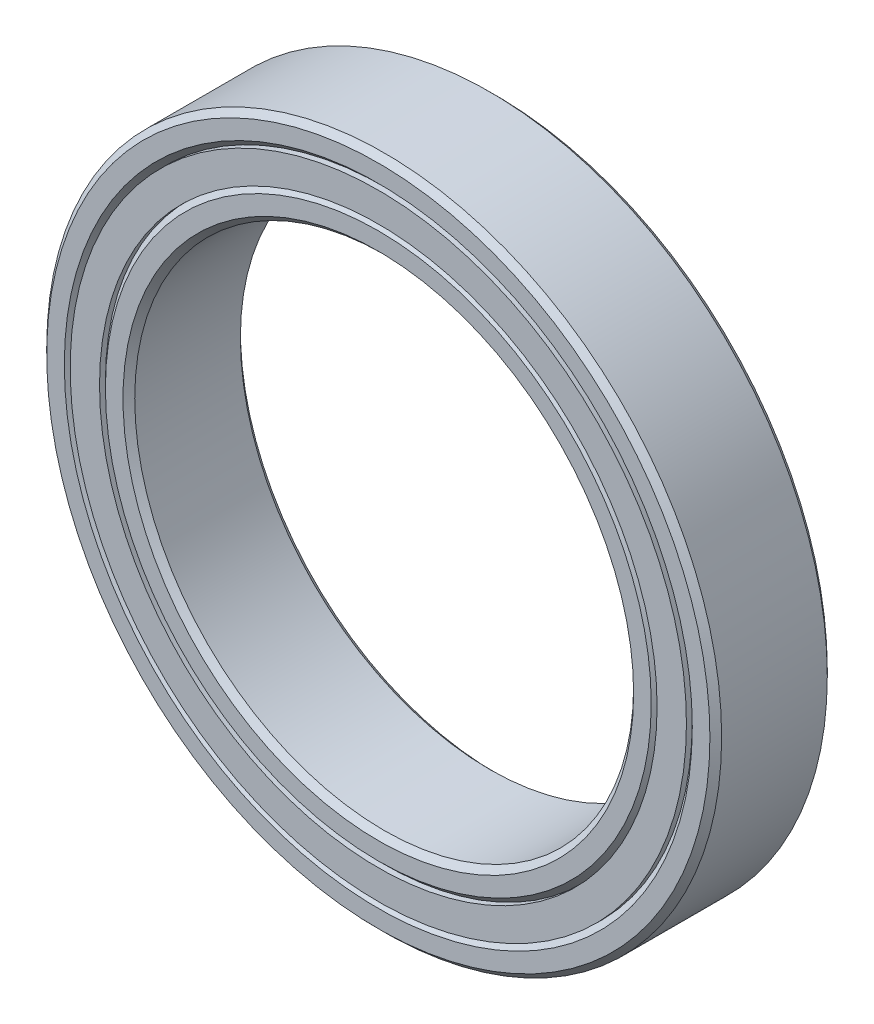
ISO-10303-21;
HEADER;
FILE_DESCRIPTION(('STEP AP214'),'2;1');
FILE_NAME('part.step','',(''),(''),'','','');
FILE_SCHEMA(('AUTOMOTIVE_DESIGN { 1 0 10303 214 1 1 1 1 }'));
ENDSEC;
DATA;
#1=APPLICATION_CONTEXT('core data for automotive mechanical design processes');
#2=APPLICATION_PROTOCOL_DEFINITION('international standard','automotive_design',2000,#1);
#3=PRODUCT_CONTEXT('',#1,'mechanical');
#4=PRODUCT('Part','Part','',(#3));
#5=PRODUCT_RELATED_PRODUCT_CATEGORY('part','',(#4));
#6=PRODUCT_DEFINITION_FORMATION('','',#4);
#7=PRODUCT_DEFINITION_CONTEXT('part definition',#1,'design');
#8=PRODUCT_DEFINITION('design','',#6,#7);
#9=PRODUCT_DEFINITION_SHAPE('','',#8);
#10=(LENGTH_UNIT() NAMED_UNIT(*) SI_UNIT(.MILLI.,.METRE.));
#11=(NAMED_UNIT(*) PLANE_ANGLE_UNIT() SI_UNIT($,.RADIAN.));
#12=(NAMED_UNIT(*) SI_UNIT($,.STERADIAN.) SOLID_ANGLE_UNIT());
#13=UNCERTAINTY_MEASURE_WITH_UNIT(LENGTH_MEASURE(1.E-05),#10,'distance_accuracy_value','');
#14=(GEOMETRIC_REPRESENTATION_CONTEXT(3) GLOBAL_UNCERTAINTY_ASSIGNED_CONTEXT((#13)) GLOBAL_UNIT_ASSIGNED_CONTEXT((#10,
#11,#12)) REPRESENTATION_CONTEXT('',''));
#15=CARTESIAN_POINT('',(0.,0.,0.));
#16=DIRECTION('',(0.,0.,1.));
#17=DIRECTION('',(1.,0.,0.));
#18=AXIS2_PLACEMENT_3D('',#15,#16,#17);
#19=CARTESIAN_POINT('',(0.,0.,4.));
#20=DIRECTION('',(0.,0.,-1.));
#21=DIRECTION('',(-1.,0.,0.));
#22=AXIS2_PLACEMENT_3D('',#19,#20,#21);
#23=CYLINDRICAL_SURFACE('',#22,9.5);
#24=CARTESIAN_POINT('',(0.,0.,0.199999999999997));
#25=DIRECTION('',(0.,0.,1.));
#26=DIRECTION('',(1.,0.,0.));
#27=AXIS2_PLACEMENT_3D('',#24,#25,#26);
#28=CIRCLE('',#27,9.5);
#29=CARTESIAN_POINT('',(9.5,0.,0.199999999999997));
#30=VERTEX_POINT('',#29);
#31=EDGE_CURVE('E11',#30,#30,#28,.F.);
#32=ORIENTED_EDGE('',*,*,#31,.F.);
#33=EDGE_LOOP('',(#32));
#34=FACE_BOUND('',#33,.T.);
#35=CARTESIAN_POINT('',(0.,0.,0.));
#36=DIRECTION('',(0.,0.,1.));
#37=DIRECTION('',(1.,0.,0.));
#38=AXIS2_PLACEMENT_3D('',#35,#36,#37);
#39=CIRCLE('',#38,9.5);
#40=CARTESIAN_POINT('',(9.5,0.,0.));
#41=VERTEX_POINT('',#40);
#42=EDGE_CURVE('E81',#41,#41,#39,.T.);
#43=ORIENTED_EDGE('',*,*,#42,.F.);
#44=EDGE_LOOP('',(#43));
#45=FACE_BOUND('',#44,.T.);
#46=ADVANCED_FACE('F38',(#34,#45),#23,.F.);
#47=CARTESIAN_POINT('',(0.,0.,4.));
#48=DIRECTION('',(0.,0.,-1.));
#49=DIRECTION('',(-1.,0.,0.));
#50=AXIS2_PLACEMENT_3D('',#47,#48,#49);
#51=CYLINDRICAL_SURFACE('',#50,11.5);
#52=CARTESIAN_POINT('',(0.,0.,3.8));
#53=DIRECTION('',(0.,0.,1.));
#54=DIRECTION('',(1.,0.,0.));
#55=AXIS2_PLACEMENT_3D('',#52,#53,#54);
#56=CIRCLE('',#55,11.5);
#57=CARTESIAN_POINT('',(11.5,0.,3.8));
#58=VERTEX_POINT('',#57);
#59=EDGE_CURVE('E58',#58,#58,#56,.F.);
#60=ORIENTED_EDGE('',*,*,#59,.T.);
#61=EDGE_LOOP('',(#60));
#62=FACE_BOUND('',#61,.T.);
#63=CARTESIAN_POINT('',(0.,0.,0.200000000000002));
#64=DIRECTION('',(0.,0.,1.));
#65=DIRECTION('',(1.,0.,0.));
#66=AXIS2_PLACEMENT_3D('',#63,#64,#65);
#67=CIRCLE('',#66,11.5);
#68=CARTESIAN_POINT('',(11.5,0.,0.200000000000002));
#69=VERTEX_POINT('',#68);
#70=EDGE_CURVE('E61',#69,#69,#67,.T.);
#71=ORIENTED_EDGE('',*,*,#70,.T.);
#72=EDGE_LOOP('',(#71));
#73=FACE_BOUND('',#72,.T.);
#74=ADVANCED_FACE('F124',(#62,#73),#51,.T.);
#75=CARTESIAN_POINT('',(0.,0.,4.));
#76=DIRECTION('',(0.,0.,1.));
#77=DIRECTION('',(1.,0.,0.));
#78=AXIS2_PLACEMENT_3D('',#75,#76,#77);
#79=PLANE('',#78);
#80=CARTESIAN_POINT('',(0.,0.,4.));
#81=DIRECTION('',(0.,0.,1.));
#82=DIRECTION('',(1.,0.,0.));
#83=AXIS2_PLACEMENT_3D('',#80,#81,#82);
#84=CIRCLE('',#83,10.7);
#85=CARTESIAN_POINT('',(10.7,0.,4.));
#86=VERTEX_POINT('',#85);
#87=EDGE_CURVE('E64',#86,#86,#84,.F.);
#88=ORIENTED_EDGE('',*,*,#87,.T.);
#89=EDGE_LOOP('',(#88));
#90=FACE_BOUND('',#89,.T.);
#91=CARTESIAN_POINT('',(0.,0.,4.));
#92=DIRECTION('',(0.,0.,1.));
#93=DIRECTION('',(1.,0.,0.));
#94=AXIS2_PLACEMENT_3D('',#91,#92,#93);
#95=CIRCLE('',#94,11.3);
#96=CARTESIAN_POINT('',(11.3,0.,4.));
#97=VERTEX_POINT('',#96);
#98=EDGE_CURVE('E67',#97,#97,#95,.T.);
#99=ORIENTED_EDGE('',*,*,#98,.T.);
#100=EDGE_LOOP('',(#99));
#101=FACE_BOUND('',#100,.T.);
#102=ADVANCED_FACE('F131',(#90,#101),#79,.T.);
#103=CARTESIAN_POINT('',(0.,0.,0.));
#104=DIRECTION('',(0.,0.,1.));
#105=DIRECTION('',(1.,0.,0.));
#106=AXIS2_PLACEMENT_3D('',#103,#104,#105);
#107=PLANE('',#106);
#108=CARTESIAN_POINT('',(0.,0.,0.));
#109=DIRECTION('',(0.,0.,1.));
#110=DIRECTION('',(1.,0.,0.));
#111=AXIS2_PLACEMENT_3D('',#108,#109,#110);
#112=CIRCLE('',#111,11.3);
#113=CARTESIAN_POINT('',(11.3,0.,0.));
#114=VERTEX_POINT('',#113);
#115=EDGE_CURVE('E49',#114,#114,#112,.F.);
#116=ORIENTED_EDGE('',*,*,#115,.T.);
#117=EDGE_LOOP('',(#116));
#118=FACE_BOUND('',#117,.T.);
#119=CARTESIAN_POINT('',(0.,0.,0.));
#120=DIRECTION('',(0.,0.,1.));
#121=DIRECTION('',(1.,0.,0.));
#122=AXIS2_PLACEMENT_3D('',#119,#120,#121);
#123=CIRCLE('',#122,10.7);
#124=CARTESIAN_POINT('',(10.7,0.,0.));
#125=VERTEX_POINT('',#124);
#126=EDGE_CURVE('E53',#125,#125,#123,.T.);
#127=ORIENTED_EDGE('',*,*,#126,.T.);
#128=EDGE_LOOP('',(#127));
#129=FACE_BOUND('',#128,.T.);
#130=ADVANCED_FACE('F257',(#118,#129),#107,.F.);
#131=CARTESIAN_POINT('',(0.,0.,3.8));
#132=DIRECTION('',(0.,0.,1.));
#133=DIRECTION('',(1.,0.,0.));
#134=AXIS2_PLACEMENT_3D('',#131,#132,#133);
#135=CONICAL_SURFACE('',#134,10.5,0.785398163397448);
#136=ORIENTED_EDGE('',*,*,#87,.F.);
#137=EDGE_LOOP('',(#136));
#138=FACE_BOUND('',#137,.T.);
#139=CARTESIAN_POINT('',(0.,0.,3.8));
#140=DIRECTION('',(0.,0.,1.));
#141=DIRECTION('',(1.,0.,0.));
#142=AXIS2_PLACEMENT_3D('',#139,#140,#141);
#143=CIRCLE('',#142,10.5);
#144=CARTESIAN_POINT('',(10.5,0.,3.8));
#145=VERTEX_POINT('',#144);
#146=EDGE_CURVE('E70',#145,#145,#143,.T.);
#147=ORIENTED_EDGE('',*,*,#146,.F.);
#148=EDGE_LOOP('',(#147));
#149=FACE_BOUND('',#148,.T.);
#150=ADVANCED_FACE('F247',(#138,#149),#135,.F.);
#151=CARTESIAN_POINT('',(0.,0.,4.));
#152=DIRECTION('',(0.,0.,-1.));
#153=DIRECTION('',(-1.,0.,0.));
#154=AXIS2_PLACEMENT_3D('',#151,#152,#153);
#155=CONICAL_SURFACE('',#154,11.3,0.785398163397453);
#156=ORIENTED_EDGE('',*,*,#59,.F.);
#157=EDGE_LOOP('',(#156));
#158=FACE_BOUND('',#157,.T.);
#159=ORIENTED_EDGE('',*,*,#98,.F.);
#160=EDGE_LOOP('',(#159));
#161=FACE_BOUND('',#160,.T.);
#162=ADVANCED_FACE('F238',(#158,#161),#155,.T.);
#163=CARTESIAN_POINT('',(0.,0.,0.200000000000002));
#164=DIRECTION('',(0.,0.,1.));
#165=DIRECTION('',(1.,0.,0.));
#166=AXIS2_PLACEMENT_3D('',#163,#164,#165);
#167=CONICAL_SURFACE('',#166,11.5,0.785398163397448);
#168=ORIENTED_EDGE('',*,*,#115,.F.);
#169=EDGE_LOOP('',(#168));
#170=FACE_BOUND('',#169,.T.);
#171=ORIENTED_EDGE('',*,*,#70,.F.);
#172=EDGE_LOOP('',(#171));
#173=FACE_BOUND('',#172,.T.);
#174=ADVANCED_FACE('F229',(#170,#173),#167,.T.);
#175=CARTESIAN_POINT('',(0.,0.,0.));
#176=DIRECTION('',(0.,0.,-1.));
#177=DIRECTION('',(-1.,0.,0.));
#178=AXIS2_PLACEMENT_3D('',#175,#176,#177);
#179=CONICAL_SURFACE('',#178,10.7,0.785398163397448);
#180=CARTESIAN_POINT('',(0.,0.,0.199999999999999));
#181=DIRECTION('',(0.,0.,1.));
#182=DIRECTION('',(1.,0.,0.));
#183=AXIS2_PLACEMENT_3D('',#180,#181,#182);
#184=CIRCLE('',#183,10.5);
#185=CARTESIAN_POINT('',(10.5,0.,0.199999999999999));
#186=VERTEX_POINT('',#185);
#187=EDGE_CURVE('E73',#186,#186,#184,.F.);
#188=ORIENTED_EDGE('',*,*,#187,.F.);
#189=EDGE_LOOP('',(#188));
#190=FACE_BOUND('',#189,.T.);
#191=ORIENTED_EDGE('',*,*,#126,.F.);
#192=EDGE_LOOP('',(#191));
#193=FACE_BOUND('',#192,.T.);
#194=ADVANCED_FACE('F40',(#190,#193),#179,.F.);
#195=CARTESIAN_POINT('',(0.,0.,4.));
#196=DIRECTION('',(0.,0.,-1.));
#197=DIRECTION('',(-1.,0.,0.));
#198=AXIS2_PLACEMENT_3D('',#195,#196,#197);
#199=CYLINDRICAL_SURFACE('',#198,10.5);
#200=ORIENTED_EDGE('',*,*,#146,.T.);
#201=EDGE_LOOP('',(#200));
#202=FACE_BOUND('',#201,.T.);
#203=CARTESIAN_POINT('',(0.,0.,4.));
#204=DIRECTION('',(0.,0.,1.));
#205=DIRECTION('',(1.,0.,0.));
#206=AXIS2_PLACEMENT_3D('',#203,#204,#205);
#207=CIRCLE('',#206,10.5);
#208=CARTESIAN_POINT('',(10.5,0.,4.));
#209=VERTEX_POINT('',#208);
#210=EDGE_CURVE('E76',#209,#209,#207,.T.);
#211=ORIENTED_EDGE('',*,*,#210,.F.);
#212=EDGE_LOOP('',(#211));
#213=FACE_BOUND('',#212,.T.);
#214=ADVANCED_FACE('F139',(#202,#213),#199,.T.);
#215=CARTESIAN_POINT('',(0.,0.,3.8));
#216=DIRECTION('',(0.,0.,-1.));
#217=DIRECTION('',(-1.,0.,0.));
#218=AXIS2_PLACEMENT_3D('',#215,#216,#217);
#219=CIRCLE('',#218,9.5);
#220=CARTESIAN_POINT('',(-9.5,0.,3.8));
#221=VERTEX_POINT('',#220);
#222=EDGE_CURVE('E45',#221,#221,#219,.F.);
#223=ORIENTED_EDGE('',*,*,#222,.F.);
#224=EDGE_LOOP('',(#223));
#225=FACE_BOUND('',#224,.T.);
#226=CARTESIAN_POINT('',(0.,0.,4.));
#227=DIRECTION('',(0.,0.,1.));
#228=DIRECTION('',(1.,0.,0.));
#229=AXIS2_PLACEMENT_3D('',#226,#227,#228);
#230=CIRCLE('',#229,9.5);
#231=CARTESIAN_POINT('',(9.5,0.,4.));
#232=VERTEX_POINT('',#231);
#233=EDGE_CURVE('E80',#232,#232,#230,.T.);
#234=ORIENTED_EDGE('',*,*,#233,.T.);
#235=EDGE_LOOP('',(#234));
#236=FACE_BOUND('',#235,.T.);
#237=ADVANCED_FACE('F127',(#225,#236),#23,.F.);
#238=ORIENTED_EDGE('',*,*,#187,.T.);
#239=EDGE_LOOP('',(#238));
#240=FACE_BOUND('',#239,.T.);
#241=CARTESIAN_POINT('',(0.,0.,0.));
#242=DIRECTION('',(0.,0.,1.));
#243=DIRECTION('',(1.,0.,0.));
#244=AXIS2_PLACEMENT_3D('',#241,#242,#243);
#245=CIRCLE('',#244,10.5);
#246=CARTESIAN_POINT('',(10.5,0.,0.));
#247=VERTEX_POINT('',#246);
#248=EDGE_CURVE('E77',#247,#247,#245,.T.);
#249=ORIENTED_EDGE('',*,*,#248,.T.);
#250=EDGE_LOOP('',(#249));
#251=FACE_BOUND('',#250,.T.);
#252=ADVANCED_FACE('F138',(#240,#251),#199,.T.);
#253=CARTESIAN_POINT('',(0.,0.,4.));
#254=DIRECTION('',(0.,0.,1.));
#255=DIRECTION('',(1.,0.,0.));
#256=AXIS2_PLACEMENT_3D('',#253,#254,#255);
#257=PLANE('',#256);
#258=ORIENTED_EDGE('',*,*,#233,.F.);
#259=EDGE_LOOP('',(#258));
#260=FACE_BOUND('',#259,.T.);
#261=ORIENTED_EDGE('',*,*,#210,.T.);
#262=EDGE_LOOP('',(#261));
#263=FACE_BOUND('',#262,.T.);
#264=ADVANCED_FACE('F145',(#260,#263),#257,.T.);
#265=CARTESIAN_POINT('',(0.,0.,0.));
#266=DIRECTION('',(0.,0.,1.));
#267=DIRECTION('',(1.,0.,0.));
#268=AXIS2_PLACEMENT_3D('',#265,#266,#267);
#269=PLANE('',#268);
#270=ORIENTED_EDGE('',*,*,#42,.T.);
#271=EDGE_LOOP('',(#270));
#272=FACE_BOUND('',#271,.T.);
#273=ORIENTED_EDGE('',*,*,#248,.F.);
#274=EDGE_LOOP('',(#273));
#275=FACE_BOUND('',#274,.T.);
#276=ADVANCED_FACE('F153',(#272,#275),#269,.F.);
#277=CARTESIAN_POINT('',(0.,0.,4.));
#278=DIRECTION('',(0.,0.,-1.));
#279=DIRECTION('',(-1.,0.,0.));
#280=AXIS2_PLACEMENT_3D('',#277,#278,#279);
#281=CYLINDRICAL_SURFACE('',#280,8.5);
#282=CARTESIAN_POINT('',(0.,0.,0.200000000000001));
#283=DIRECTION('',(0.,0.,1.));
#284=DIRECTION('',(1.,0.,0.));
#285=AXIS2_PLACEMENT_3D('',#282,#283,#284);
#286=CIRCLE('',#285,8.5);
#287=CARTESIAN_POINT('',(8.5,0.,0.200000000000001));
#288=VERTEX_POINT('',#287);
#289=EDGE_CURVE('E94',#288,#288,#286,.F.);
#290=ORIENTED_EDGE('',*,*,#289,.T.);
#291=EDGE_LOOP('',(#290));
#292=FACE_BOUND('',#291,.T.);
#293=CARTESIAN_POINT('',(0.,0.,3.8));
#294=DIRECTION('',(0.,0.,1.));
#295=DIRECTION('',(1.,0.,0.));
#296=AXIS2_PLACEMENT_3D('',#293,#294,#295);
#297=CIRCLE('',#296,8.5);
#298=CARTESIAN_POINT('',(8.5,0.,3.8));
#299=VERTEX_POINT('',#298);
#300=EDGE_CURVE('E97',#299,#299,#297,.T.);
#301=ORIENTED_EDGE('',*,*,#300,.T.);
#302=EDGE_LOOP('',(#301));
#303=FACE_BOUND('',#302,.T.);
#304=ADVANCED_FACE('F160',(#292,#303),#281,.F.);
#305=CARTESIAN_POINT('',(0.,0.,4.));
#306=DIRECTION('',(0.,0.,1.));
#307=DIRECTION('',(1.,0.,0.));
#308=AXIS2_PLACEMENT_3D('',#305,#306,#307);
#309=PLANE('',#308);
#310=CARTESIAN_POINT('',(0.,0.,4.));
#311=DIRECTION('',(0.,0.,1.));
#312=DIRECTION('',(1.,0.,0.));
#313=AXIS2_PLACEMENT_3D('',#310,#311,#312);
#314=CIRCLE('',#313,8.7);
#315=CARTESIAN_POINT('',(8.7,0.,4.));
#316=VERTEX_POINT('',#315);
#317=EDGE_CURVE('E84',#316,#316,#314,.F.);
#318=ORIENTED_EDGE('',*,*,#317,.T.);
#319=EDGE_LOOP('',(#318));
#320=FACE_BOUND('',#319,.T.);
#321=CARTESIAN_POINT('',(0.,0.,4.));
#322=DIRECTION('',(0.,0.,1.));
#323=DIRECTION('',(1.,0.,0.));
#324=AXIS2_PLACEMENT_3D('',#321,#322,#323);
#325=CIRCLE('',#324,9.3);
#326=CARTESIAN_POINT('',(9.3,0.,4.));
#327=VERTEX_POINT('',#326);
#328=EDGE_CURVE('E91',#327,#327,#325,.T.);
#329=ORIENTED_EDGE('',*,*,#328,.T.);
#330=EDGE_LOOP('',(#329));
#331=FACE_BOUND('',#330,.T.);
#332=ADVANCED_FACE('F170',(#320,#331),#309,.T.);
#333=CARTESIAN_POINT('',(0.,0.,0.));
#334=DIRECTION('',(0.,0.,1.));
#335=DIRECTION('',(1.,0.,0.));
#336=AXIS2_PLACEMENT_3D('',#333,#334,#335);
#337=PLANE('',#336);
#338=CARTESIAN_POINT('',(0.,0.,0.));
#339=DIRECTION('',(0.,0.,1.));
#340=DIRECTION('',(1.,0.,0.));
#341=AXIS2_PLACEMENT_3D('',#338,#339,#340);
#342=CIRCLE('',#341,8.7);
#343=CARTESIAN_POINT('',(8.7,0.,0.));
#344=VERTEX_POINT('',#343);
#345=EDGE_CURVE('E100',#344,#344,#342,.T.);
#346=ORIENTED_EDGE('',*,*,#345,.T.);
#347=EDGE_LOOP('',(#346));
#348=FACE_BOUND('',#347,.T.);
#349=CARTESIAN_POINT('',(0.,0.,0.));
#350=DIRECTION('',(0.,0.,1.));
#351=DIRECTION('',(1.,0.,0.));
#352=AXIS2_PLACEMENT_3D('',#349,#350,#351);
#353=CIRCLE('',#352,9.3);
#354=CARTESIAN_POINT('',(9.3,0.,0.));
#355=VERTEX_POINT('',#354);
#356=EDGE_CURVE('E103',#355,#355,#353,.F.);
#357=ORIENTED_EDGE('',*,*,#356,.T.);
#358=EDGE_LOOP('',(#357));
#359=FACE_BOUND('',#358,.T.);
#360=ADVANCED_FACE('F107',(#348,#359),#337,.F.);
#361=CARTESIAN_POINT('',(0.,0.,0.));
#362=DIRECTION('',(0.,0.,-1.));
#363=DIRECTION('',(-1.,0.,0.));
#364=AXIS2_PLACEMENT_3D('',#361,#362,#363);
#365=CONICAL_SURFACE('',#364,8.7,0.785398163397448);
#366=ORIENTED_EDGE('',*,*,#289,.F.);
#367=EDGE_LOOP('',(#366));
#368=FACE_BOUND('',#367,.T.);
#369=ORIENTED_EDGE('',*,*,#345,.F.);
#370=EDGE_LOOP('',(#369));
#371=FACE_BOUND('',#370,.T.);
#372=ADVANCED_FACE('F112',(#368,#371),#365,.F.);
#373=CARTESIAN_POINT('',(0.,0.,0.199999999999997));
#374=DIRECTION('',(0.,0.,1.));
#375=DIRECTION('',(1.,0.,0.));
#376=AXIS2_PLACEMENT_3D('',#373,#374,#375);
#377=CONICAL_SURFACE('',#376,9.5,0.785398163397453);
#378=ORIENTED_EDGE('',*,*,#356,.F.);
#379=EDGE_LOOP('',(#378));
#380=FACE_BOUND('',#379,.T.);
#381=ORIENTED_EDGE('',*,*,#31,.T.);
#382=EDGE_LOOP('',(#381));
#383=FACE_BOUND('',#382,.T.);
#384=ADVANCED_FACE('F109',(#380,#383),#377,.T.);
#385=CARTESIAN_POINT('',(0.,0.,3.8));
#386=DIRECTION('',(0.,0.,1.));
#387=DIRECTION('',(1.,0.,0.));
#388=AXIS2_PLACEMENT_3D('',#385,#386,#387);
#389=CONICAL_SURFACE('',#388,8.5,0.785398163397457);
#390=ORIENTED_EDGE('',*,*,#317,.F.);
#391=EDGE_LOOP('',(#390));
#392=FACE_BOUND('',#391,.T.);
#393=ORIENTED_EDGE('',*,*,#300,.F.);
#394=EDGE_LOOP('',(#393));
#395=FACE_BOUND('',#394,.T.);
#396=ADVANCED_FACE('F111',(#392,#395),#389,.F.);
#397=CARTESIAN_POINT('',(0.,0.,4.));
#398=DIRECTION('',(0.,0.,-1.));
#399=DIRECTION('',(-1.,0.,0.));
#400=AXIS2_PLACEMENT_3D('',#397,#398,#399);
#401=CONICAL_SURFACE('',#400,9.3,0.785398163397444);
#402=ORIENTED_EDGE('',*,*,#222,.T.);
#403=EDGE_LOOP('',(#402));
#404=FACE_BOUND('',#403,.T.);
#405=ORIENTED_EDGE('',*,*,#328,.F.);
#406=EDGE_LOOP('',(#405));
#407=FACE_BOUND('',#406,.T.);
#408=ADVANCED_FACE('F118',(#404,#407),#401,.T.);
#409=CLOSED_SHELL('',(#46,#74,#102,#130,#150,#162,#174,#194,#214,#237,#252,#264,#276,#304,#332,
#360,#372,#384,#396,#408));
#410=MANIFOLD_SOLID_BREP('B2',#409);
#411=ADVANCED_BREP_SHAPE_REPRESENTATION('',(#18,#410),#14);
#412=SHAPE_DEFINITION_REPRESENTATION(#9,#411);
ENDSEC;
END-ISO-10303-21;
